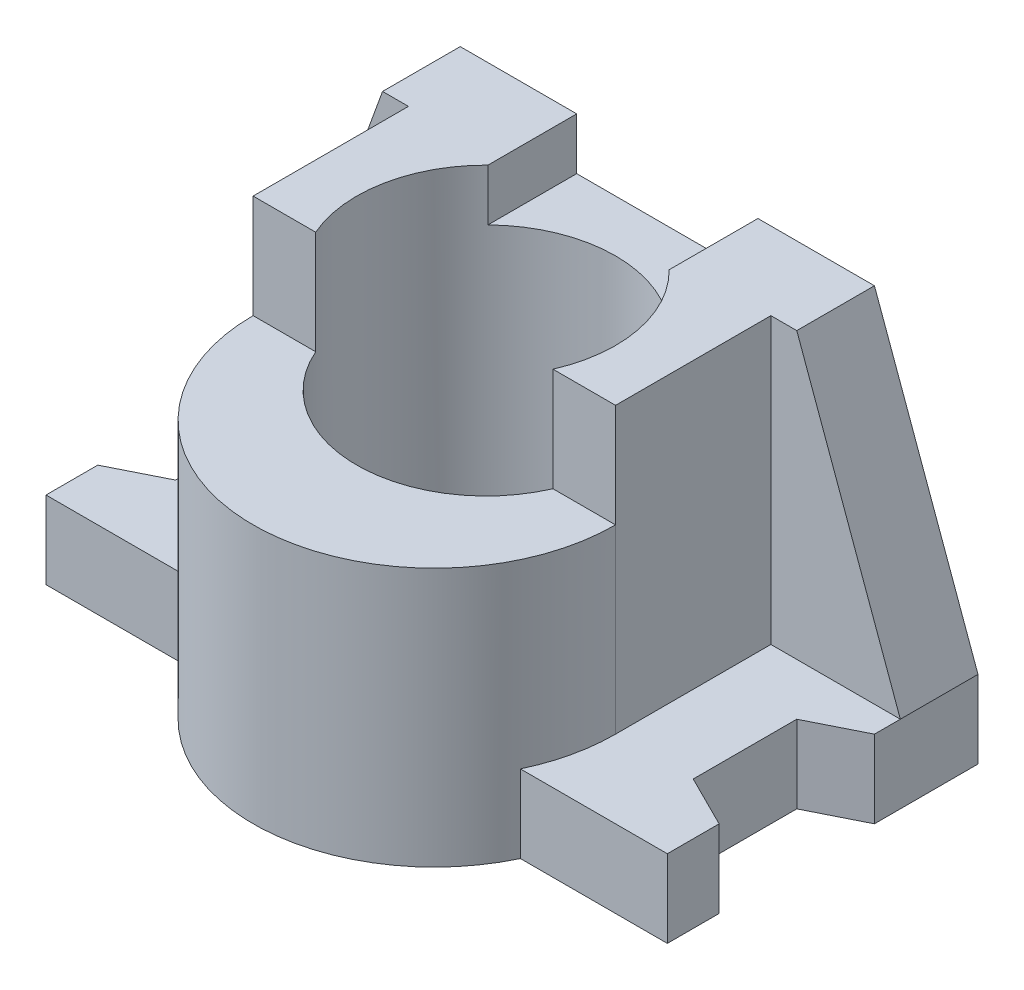
ISO-10303-21;
HEADER;
FILE_DESCRIPTION(('STEP AP214'),'2;1');
FILE_NAME('part.step','',(''),(''),'','','');
FILE_SCHEMA(('AUTOMOTIVE_DESIGN { 1 0 10303 214 1 1 1 1 }'));
ENDSEC;
DATA;
#1=APPLICATION_CONTEXT('core data for automotive mechanical design processes');
#2=APPLICATION_PROTOCOL_DEFINITION('international standard','automotive_design',2000,#1);
#3=PRODUCT_CONTEXT('',#1,'mechanical');
#4=PRODUCT('Part','Part','',(#3));
#5=PRODUCT_RELATED_PRODUCT_CATEGORY('part','',(#4));
#6=PRODUCT_DEFINITION_FORMATION('','',#4);
#7=PRODUCT_DEFINITION_CONTEXT('part definition',#1,'design');
#8=PRODUCT_DEFINITION('design','',#6,#7);
#9=PRODUCT_DEFINITION_SHAPE('','',#8);
#10=(LENGTH_UNIT() NAMED_UNIT(*) SI_UNIT(.MILLI.,.METRE.));
#11=(NAMED_UNIT(*) PLANE_ANGLE_UNIT() SI_UNIT($,.RADIAN.));
#12=(NAMED_UNIT(*) SI_UNIT($,.STERADIAN.) SOLID_ANGLE_UNIT());
#13=UNCERTAINTY_MEASURE_WITH_UNIT(LENGTH_MEASURE(1.E-05),#10,'distance_accuracy_value','');
#14=(GEOMETRIC_REPRESENTATION_CONTEXT(3) GLOBAL_UNCERTAINTY_ASSIGNED_CONTEXT((#13)) GLOBAL_UNIT_ASSIGNED_CONTEXT((#10,
#11,#12)) REPRESENTATION_CONTEXT('',''));
#15=CARTESIAN_POINT('',(0.,0.,0.));
#16=DIRECTION('',(0.,0.,1.));
#17=DIRECTION('',(1.,0.,0.));
#18=AXIS2_PLACEMENT_3D('',#15,#16,#17);
#19=CARTESIAN_POINT('',(0.,15.,0.));
#20=DIRECTION('',(0.,1.,0.));
#21=DIRECTION('',(0.,0.,1.));
#22=AXIS2_PLACEMENT_3D('',#19,#20,#21);
#23=PLANE('',#22);
#24=DIRECTION('',(0.,0.,1.));
#25=VECTOR('',#24,1.);
#26=CARTESIAN_POINT('',(60.,15.,0.));
#27=LINE('',#26,#25);
#28=CARTESIAN_POINT('',(60.,15.,-7.27417801355407));
#29=VERTEX_POINT('',#28);
#30=CARTESIAN_POINT('',(60.,15.,-2.27417801355408));
#31=VERTEX_POINT('',#30);
#32=EDGE_CURVE('E339',#29,#31,#27,.T.);
#33=ORIENTED_EDGE('',*,*,#32,.F.);
#34=DIRECTION('',(-1.,0.,0.));
#35=VECTOR('',#34,1.);
#36=CARTESIAN_POINT('',(0.,15.,-7.27417801355405));
#37=LINE('',#36,#35);
#38=CARTESIAN_POINT('',(35.,15.,-7.27417801355407));
#39=VERTEX_POINT('',#38);
#40=EDGE_CURVE('E54',#29,#39,#37,.T.);
#41=ORIENTED_EDGE('',*,*,#40,.T.);
#42=DIRECTION('',(0.,0.,1.));
#43=VECTOR('',#42,1.);
#44=CARTESIAN_POINT('',(35.,15.,0.));
#45=LINE('',#44,#43);
#46=CARTESIAN_POINT('',(35.,15.,22.7258219864459));
#47=VERTEX_POINT('',#46);
#48=EDGE_CURVE('E344',#39,#47,#45,.T.);
#49=ORIENTED_EDGE('',*,*,#48,.T.);
#50=CARTESIAN_POINT('',(0.,15.,22.7258219864459));
#51=DIRECTION('',(0.,1.,0.));
#52=DIRECTION('',(0.,0.,1.));
#53=AXIS2_PLACEMENT_3D('',#50,#51,#52);
#54=CIRCLE('',#53,35.);
#55=CARTESIAN_POINT('',(31.6227766016838,15.,37.7258219864459));
#56=VERTEX_POINT('',#55);
#57=EDGE_CURVE('E322',#56,#47,#54,.T.);
#58=ORIENTED_EDGE('',*,*,#57,.F.);
#59=DIRECTION('',(-1.,0.,0.));
#60=VECTOR('',#59,1.);
#61=CARTESIAN_POINT('',(0.,15.,37.7258219864459));
#62=LINE('',#61,#60);
#63=CARTESIAN_POINT('',(60.,15.,37.7258219864459));
#64=VERTEX_POINT('',#63);
#65=EDGE_CURVE('E325',#64,#56,#62,.T.);
#66=ORIENTED_EDGE('',*,*,#65,.F.);
#67=DIRECTION('',(0.,0.,-1.));
#68=VECTOR('',#67,1.);
#69=CARTESIAN_POINT('',(60.,15.,0.));
#70=LINE('',#69,#68);
#71=CARTESIAN_POINT('',(60.,15.,27.7258219864459));
#72=VERTEX_POINT('',#71);
#73=EDGE_CURVE('E329',#64,#72,#70,.T.);
#74=ORIENTED_EDGE('',*,*,#73,.T.);
#75=DIRECTION('',(0.894427190999916,0.,0.447213595499958));
#76=VECTOR('',#75,1.);
#77=CARTESIAN_POINT('',(0.90967120542162,15.,-1.81934241084324));
#78=LINE('',#77,#76);
#79=CARTESIAN_POINT('',(50.,15.,22.7258219864459));
#80=VERTEX_POINT('',#79);
#81=EDGE_CURVE('E331',#80,#72,#78,.T.);
#82=ORIENTED_EDGE('',*,*,#81,.F.);
#83=DIRECTION('',(0.,0.,-1.));
#84=VECTOR('',#83,1.);
#85=CARTESIAN_POINT('',(50.,15.,0.));
#86=LINE('',#85,#84);
#87=CARTESIAN_POINT('',(50.,15.,2.72582198644592));
#88=VERTEX_POINT('',#87);
#89=EDGE_CURVE('E334',#80,#88,#86,.T.);
#90=ORIENTED_EDGE('',*,*,#89,.T.);
#91=DIRECTION('',(-0.894427190999916,0.,0.447213595499958));
#92=VECTOR('',#91,1.);
#93=CARTESIAN_POINT('',(11.0903287945784,15.,22.1806575891567));
#94=LINE('',#93,#92);
#95=EDGE_CURVE('E336',#31,#88,#94,.T.);
#96=ORIENTED_EDGE('',*,*,#95,.F.);
#97=EDGE_LOOP('',(#33,#41,#49,#58,#66,#74,#82,#90,#96));
#98=FACE_BOUND('',#97,.T.);
#99=ADVANCED_FACE('F39',(#98),#23,.T.);
#100=CARTESIAN_POINT('',(0.,15.,-22.2741780135541));
#101=DIRECTION('',(0.,0.,1.));
#102=DIRECTION('',(1.,0.,0.));
#103=AXIS2_PLACEMENT_3D('',#100,#101,#102);
#104=PLANE('',#103);
#105=DIRECTION('',(0.341743063086704,-0.939793423488437,0.));
#106=VECTOR('',#105,1.);
#107=CARTESIAN_POINT('',(40.,70.,-22.2741780135541));
#108=LINE('',#107,#106);
#109=CARTESIAN_POINT('',(40.,70.,-22.2741780135541));
#110=VERTEX_POINT('',#109);
#111=CARTESIAN_POINT('',(60.,15.,-22.2741780135541));
#112=VERTEX_POINT('',#111);
#113=EDGE_CURVE('E244',#110,#112,#108,.T.);
#114=ORIENTED_EDGE('',*,*,#113,.T.);
#115=DIRECTION('',(0.,-1.,0.));
#116=VECTOR('',#115,1.);
#117=CARTESIAN_POINT('',(60.,15.,-22.2741780135541));
#118=LINE('',#117,#116);
#119=CARTESIAN_POINT('',(60.,0.,-22.2741780135541));
#120=VERTEX_POINT('',#119);
#121=EDGE_CURVE('E347',#112,#120,#118,.T.);
#122=ORIENTED_EDGE('',*,*,#121,.T.);
#123=DIRECTION('',(-1.,0.,0.));
#124=VECTOR('',#123,1.);
#125=CARTESIAN_POINT('',(0.,0.,-22.2741780135541));
#126=LINE('',#125,#124);
#127=CARTESIAN_POINT('',(-60.,0.,-22.2741780135541));
#128=VERTEX_POINT('',#127);
#129=EDGE_CURVE('E400',#120,#128,#126,.T.);
#130=ORIENTED_EDGE('',*,*,#129,.T.);
#131=DIRECTION('',(0.,-1.,0.));
#132=VECTOR('',#131,1.);
#133=CARTESIAN_POINT('',(-60.,15.,-22.2741780135541));
#134=LINE('',#133,#132);
#135=CARTESIAN_POINT('',(-60.,15.,-22.2741780135541));
#136=VERTEX_POINT('',#135);
#137=EDGE_CURVE('E11',#136,#128,#134,.T.);
#138=ORIENTED_EDGE('',*,*,#137,.F.);
#139=DIRECTION('',(0.341743063086704,0.939793423488437,0.));
#140=VECTOR('',#139,1.);
#141=CARTESIAN_POINT('',(-40.,70.,-22.2741780135541));
#142=LINE('',#141,#140);
#143=CARTESIAN_POINT('',(-40.,70.,-22.2741780135541));
#144=VERTEX_POINT('',#143);
#145=EDGE_CURVE('E248',#136,#144,#142,.T.);
#146=ORIENTED_EDGE('',*,*,#145,.T.);
#147=DIRECTION('',(1.,0.,0.));
#148=VECTOR('',#147,1.);
#149=CARTESIAN_POINT('',(0.,70.,-22.2741780135541));
#150=LINE('',#149,#148);
#151=CARTESIAN_POINT('',(-17.5,70.,-22.2741780135541));
#152=VERTEX_POINT('',#151);
#153=EDGE_CURVE('E293',#144,#152,#150,.T.);
#154=ORIENTED_EDGE('',*,*,#153,.T.);
#155=DIRECTION('',(0.,-1.,0.));
#156=VECTOR('',#155,1.);
#157=CARTESIAN_POINT('',(-17.5,70.,-22.2741780135541));
#158=LINE('',#157,#156);
#159=CARTESIAN_POINT('',(-17.5,60.,-22.2741780135541));
#160=VERTEX_POINT('',#159);
#161=EDGE_CURVE('E315',#152,#160,#158,.T.);
#162=ORIENTED_EDGE('',*,*,#161,.T.);
#163=DIRECTION('',(1.,0.,0.));
#164=VECTOR('',#163,1.);
#165=CARTESIAN_POINT('',(0.,60.,-22.2741780135541));
#166=LINE('',#165,#164);
#167=CARTESIAN_POINT('',(17.5,60.,-22.2741780135541));
#168=VERTEX_POINT('',#167);
#169=EDGE_CURVE('E261',#160,#168,#166,.T.);
#170=ORIENTED_EDGE('',*,*,#169,.T.);
#171=DIRECTION('',(0.,-1.,0.));
#172=VECTOR('',#171,1.);
#173=CARTESIAN_POINT('',(17.5,70.,-22.2741780135541));
#174=LINE('',#173,#172);
#175=CARTESIAN_POINT('',(17.5,70.,-22.2741780135541));
#176=VERTEX_POINT('',#175);
#177=EDGE_CURVE('E62',#176,#168,#174,.T.);
#178=ORIENTED_EDGE('',*,*,#177,.F.);
#179=DIRECTION('',(1.,0.,0.));
#180=VECTOR('',#179,1.);
#181=CARTESIAN_POINT('',(0.,70.,-22.2741780135541));
#182=LINE('',#181,#180);
#183=EDGE_CURVE('E245',#176,#110,#182,.T.);
#184=ORIENTED_EDGE('',*,*,#183,.T.);
#185=EDGE_LOOP('',(#114,#122,#130,#138,#146,#154,#162,#170,#178,#184));
#186=FACE_BOUND('',#185,.T.);
#187=ADVANCED_FACE('F41',(#186),#104,.F.);
#188=CARTESIAN_POINT('',(-60.,15.,0.));
#189=DIRECTION('',(1.,0.,0.));
#190=DIRECTION('',(0.,0.,-1.));
#191=AXIS2_PLACEMENT_3D('',#188,#189,#190);
#192=PLANE('',#191);
#193=DIRECTION('',(0.,0.,1.));
#194=VECTOR('',#193,1.);
#195=CARTESIAN_POINT('',(-60.,0.,0.));
#196=LINE('',#195,#194);
#197=CARTESIAN_POINT('',(-60.,0.,-2.27417801355408));
#198=VERTEX_POINT('',#197);
#199=EDGE_CURVE('E428',#128,#198,#196,.T.);
#200=ORIENTED_EDGE('',*,*,#199,.T.);
#201=DIRECTION('',(0.,-1.,0.));
#202=VECTOR('',#201,1.);
#203=CARTESIAN_POINT('',(-60.,15.,-2.27417801355408));
#204=LINE('',#203,#202);
#205=CARTESIAN_POINT('',(-60.,15.,-2.27417801355408));
#206=VERTEX_POINT('',#205);
#207=EDGE_CURVE('E47',#206,#198,#204,.T.);
#208=ORIENTED_EDGE('',*,*,#207,.F.);
#209=DIRECTION('',(0.,0.,1.));
#210=VECTOR('',#209,1.);
#211=CARTESIAN_POINT('',(-60.,15.,0.));
#212=LINE('',#211,#210);
#213=CARTESIAN_POINT('',(-60.,15.,-7.27417801355408));
#214=VERTEX_POINT('',#213);
#215=EDGE_CURVE('E409',#214,#206,#212,.T.);
#216=ORIENTED_EDGE('',*,*,#215,.F.);
#217=EDGE_CURVE('E410',#136,#214,#212,.T.);
#218=ORIENTED_EDGE('',*,*,#217,.F.);
#219=ORIENTED_EDGE('',*,*,#137,.T.);
#220=EDGE_LOOP('',(#200,#208,#216,#218,#219));
#221=FACE_BOUND('',#220,.T.);
#222=ADVANCED_FACE('F476',(#221),#192,.F.);
#223=CARTESIAN_POINT('',(-11.0903287945784,15.,22.1806575891567));
#224=DIRECTION('',(0.447213595499958,0.,-0.894427190999916));
#225=DIRECTION('',(-0.894427190999916,0.,-0.447213595499958));
#226=AXIS2_PLACEMENT_3D('',#223,#224,#225);
#227=PLANE('',#226);
#228=DIRECTION('',(0.894427190999916,0.,0.447213595499958));
#229=VECTOR('',#228,1.);
#230=CARTESIAN_POINT('',(-11.0903287945784,0.,22.1806575891567));
#231=LINE('',#230,#229);
#232=CARTESIAN_POINT('',(-50.,0.,2.72582198644592));
#233=VERTEX_POINT('',#232);
#234=EDGE_CURVE('E430',#198,#233,#231,.T.);
#235=ORIENTED_EDGE('',*,*,#234,.T.);
#236=DIRECTION('',(0.,-1.,0.));
#237=VECTOR('',#236,1.);
#238=CARTESIAN_POINT('',(-50.,15.,2.72582198644592));
#239=LINE('',#238,#237);
#240=CARTESIAN_POINT('',(-50.,15.,2.72582198644592));
#241=VERTEX_POINT('',#240);
#242=EDGE_CURVE('E452',#241,#233,#239,.T.);
#243=ORIENTED_EDGE('',*,*,#242,.F.);
#244=DIRECTION('',(0.894427190999916,0.,0.447213595499958));
#245=VECTOR('',#244,1.);
#246=CARTESIAN_POINT('',(-11.0903287945784,15.,22.1806575891567));
#247=LINE('',#246,#245);
#248=EDGE_CURVE('E413',#206,#241,#247,.T.);
#249=ORIENTED_EDGE('',*,*,#248,.F.);
#250=ORIENTED_EDGE('',*,*,#207,.T.);
#251=EDGE_LOOP('',(#235,#243,#249,#250));
#252=FACE_BOUND('',#251,.T.);
#253=ADVANCED_FACE('F458',(#252),#227,.F.);
#254=CARTESIAN_POINT('',(-50.,15.,0.));
#255=DIRECTION('',(-1.,0.,0.));
#256=DIRECTION('',(0.,0.,1.));
#257=AXIS2_PLACEMENT_3D('',#254,#255,#256);
#258=PLANE('',#257);
#259=DIRECTION('',(0.,0.,-1.));
#260=VECTOR('',#259,1.);
#261=CARTESIAN_POINT('',(-50.,0.,0.));
#262=LINE('',#261,#260);
#263=CARTESIAN_POINT('',(-50.,0.,22.7258219864459));
#264=VERTEX_POINT('',#263);
#265=EDGE_CURVE('E433',#264,#233,#262,.T.);
#266=ORIENTED_EDGE('',*,*,#265,.F.);
#267=DIRECTION('',(0.,-1.,0.));
#268=VECTOR('',#267,1.);
#269=CARTESIAN_POINT('',(-50.,15.,22.7258219864459));
#270=LINE('',#269,#268);
#271=CARTESIAN_POINT('',(-50.,15.,22.7258219864459));
#272=VERTEX_POINT('',#271);
#273=EDGE_CURVE('E450',#272,#264,#270,.T.);
#274=ORIENTED_EDGE('',*,*,#273,.F.);
#275=DIRECTION('',(0.,0.,-1.));
#276=VECTOR('',#275,1.);
#277=CARTESIAN_POINT('',(-50.,15.,0.));
#278=LINE('',#277,#276);
#279=EDGE_CURVE('E415',#272,#241,#278,.T.);
#280=ORIENTED_EDGE('',*,*,#279,.T.);
#281=ORIENTED_EDGE('',*,*,#242,.T.);
#282=EDGE_LOOP('',(#266,#274,#280,#281));
#283=FACE_BOUND('',#282,.T.);
#284=ADVANCED_FACE('F468',(#283),#258,.T.);
#285=CARTESIAN_POINT('',(-0.909671205421628,15.,-1.81934241084326));
#286=DIRECTION('',(0.447213595499958,0.,0.894427190999916));
#287=DIRECTION('',(0.894427190999916,0.,-0.447213595499958));
#288=AXIS2_PLACEMENT_3D('',#285,#286,#287);
#289=PLANE('',#288);
#290=DIRECTION('',(-0.894427190999916,0.,0.447213595499958));
#291=VECTOR('',#290,1.);
#292=CARTESIAN_POINT('',(-0.909671205421628,0.,-1.81934241084326));
#293=LINE('',#292,#291);
#294=CARTESIAN_POINT('',(-60.,0.,27.7258219864459));
#295=VERTEX_POINT('',#294);
#296=EDGE_CURVE('E436',#264,#295,#293,.T.);
#297=ORIENTED_EDGE('',*,*,#296,.T.);
#298=DIRECTION('',(0.,-1.,0.));
#299=VECTOR('',#298,1.);
#300=CARTESIAN_POINT('',(-60.,15.,27.7258219864459));
#301=LINE('',#300,#299);
#302=CARTESIAN_POINT('',(-60.,15.,27.7258219864459));
#303=VERTEX_POINT('',#302);
#304=EDGE_CURVE('E448',#303,#295,#301,.T.);
#305=ORIENTED_EDGE('',*,*,#304,.F.);
#306=DIRECTION('',(-0.894427190999916,0.,0.447213595499958));
#307=VECTOR('',#306,1.);
#308=CARTESIAN_POINT('',(-0.909671205421628,15.,-1.81934241084326));
#309=LINE('',#308,#307);
#310=EDGE_CURVE('E418',#272,#303,#309,.T.);
#311=ORIENTED_EDGE('',*,*,#310,.F.);
#312=ORIENTED_EDGE('',*,*,#273,.T.);
#313=EDGE_LOOP('',(#297,#305,#311,#312));
#314=FACE_BOUND('',#313,.T.);
#315=ADVANCED_FACE('F530',(#314),#289,.F.);
#316=CARTESIAN_POINT('',(-60.,15.,0.));
#317=DIRECTION('',(-1.,0.,0.));
#318=DIRECTION('',(0.,0.,1.));
#319=AXIS2_PLACEMENT_3D('',#316,#317,#318);
#320=PLANE('',#319);
#321=DIRECTION('',(0.,0.,-1.));
#322=VECTOR('',#321,1.);
#323=CARTESIAN_POINT('',(-60.,0.,0.));
#324=LINE('',#323,#322);
#325=CARTESIAN_POINT('',(-60.,0.,37.7258219864459));
#326=VERTEX_POINT('',#325);
#327=EDGE_CURVE('E439',#326,#295,#324,.T.);
#328=ORIENTED_EDGE('',*,*,#327,.F.);
#329=DIRECTION('',(0.,-1.,0.));
#330=VECTOR('',#329,1.);
#331=CARTESIAN_POINT('',(-60.,15.,37.7258219864459));
#332=LINE('',#331,#330);
#333=CARTESIAN_POINT('',(-60.,15.,37.7258219864459));
#334=VERTEX_POINT('',#333);
#335=EDGE_CURVE('E446',#334,#326,#332,.T.);
#336=ORIENTED_EDGE('',*,*,#335,.F.);
#337=DIRECTION('',(0.,0.,-1.));
#338=VECTOR('',#337,1.);
#339=CARTESIAN_POINT('',(-60.,15.,0.));
#340=LINE('',#339,#338);
#341=EDGE_CURVE('E420',#334,#303,#340,.T.);
#342=ORIENTED_EDGE('',*,*,#341,.T.);
#343=ORIENTED_EDGE('',*,*,#304,.T.);
#344=EDGE_LOOP('',(#328,#336,#342,#343));
#345=FACE_BOUND('',#344,.T.);
#346=ADVANCED_FACE('F527',(#345),#320,.T.);
#347=CARTESIAN_POINT('',(0.,15.,37.7258219864459));
#348=DIRECTION('',(0.,0.,-1.));
#349=DIRECTION('',(-1.,0.,0.));
#350=AXIS2_PLACEMENT_3D('',#347,#348,#349);
#351=PLANE('',#350);
#352=DIRECTION('',(1.,0.,0.));
#353=VECTOR('',#352,1.);
#354=CARTESIAN_POINT('',(0.,0.,37.7258219864459));
#355=LINE('',#354,#353);
#356=CARTESIAN_POINT('',(-31.6227766016838,0.,37.7258219864459));
#357=VERTEX_POINT('',#356);
#358=EDGE_CURVE('E404',#326,#357,#355,.T.);
#359=ORIENTED_EDGE('',*,*,#358,.T.);
#360=DIRECTION('',(0.,-1.,0.));
#361=VECTOR('',#360,1.);
#362=CARTESIAN_POINT('',(-31.6227766016838,15.,37.7258219864459));
#363=LINE('',#362,#361);
#364=CARTESIAN_POINT('',(-31.6227766016838,15.,37.7258219864459));
#365=VERTEX_POINT('',#364);
#366=EDGE_CURVE('E426',#365,#357,#363,.T.);
#367=ORIENTED_EDGE('',*,*,#366,.F.);
#368=DIRECTION('',(1.,0.,0.));
#369=VECTOR('',#368,1.);
#370=CARTESIAN_POINT('',(0.,15.,37.7258219864459));
#371=LINE('',#370,#369);
#372=EDGE_CURVE('E423',#334,#365,#371,.T.);
#373=ORIENTED_EDGE('',*,*,#372,.F.);
#374=ORIENTED_EDGE('',*,*,#335,.T.);
#375=EDGE_LOOP('',(#359,#367,#373,#374));
#376=FACE_BOUND('',#375,.T.);
#377=ADVANCED_FACE('F537',(#376),#351,.F.);
#378=CARTESIAN_POINT('',(0.,15.,0.));
#379=DIRECTION('',(0.,1.,0.));
#380=DIRECTION('',(0.,0.,1.));
#381=AXIS2_PLACEMENT_3D('',#378,#379,#380);
#382=PLANE('',#381);
#383=DIRECTION('',(1.,0.,0.));
#384=VECTOR('',#383,1.);
#385=CARTESIAN_POINT('',(0.,15.,-7.27417801355405));
#386=LINE('',#385,#384);
#387=CARTESIAN_POINT('',(-35.,15.,-7.27417801355408));
#388=VERTEX_POINT('',#387);
#389=EDGE_CURVE('E406',#214,#388,#386,.T.);
#390=ORIENTED_EDGE('',*,*,#389,.F.);
#391=ORIENTED_EDGE('',*,*,#215,.T.);
#392=ORIENTED_EDGE('',*,*,#248,.T.);
#393=ORIENTED_EDGE('',*,*,#279,.F.);
#394=ORIENTED_EDGE('',*,*,#310,.T.);
#395=ORIENTED_EDGE('',*,*,#341,.F.);
#396=ORIENTED_EDGE('',*,*,#372,.T.);
#397=CARTESIAN_POINT('',(0.,15.,22.7258219864459));
#398=DIRECTION('',(0.,1.,0.));
#399=DIRECTION('',(0.,0.,1.));
#400=AXIS2_PLACEMENT_3D('',#397,#398,#399);
#401=CIRCLE('',#400,35.);
#402=CARTESIAN_POINT('',(-35.,15.,22.7258219864459));
#403=VERTEX_POINT('',#402);
#404=EDGE_CURVE('E401',#403,#365,#401,.T.);
#405=ORIENTED_EDGE('',*,*,#404,.F.);
#406=DIRECTION('',(0.,0.,-1.));
#407=VECTOR('',#406,1.);
#408=CARTESIAN_POINT('',(-35.,15.,0.));
#409=LINE('',#408,#407);
#410=EDGE_CURVE('E403',#403,#388,#409,.T.);
#411=ORIENTED_EDGE('',*,*,#410,.T.);
#412=EDGE_LOOP('',(#390,#391,#392,#393,#394,#395,#396,#405,#411));
#413=FACE_BOUND('',#412,.T.);
#414=ADVANCED_FACE('F472',(#413),#382,.T.);
#415=CARTESIAN_POINT('',(0.,0.,0.));
#416=DIRECTION('',(0.,1.,0.));
#417=DIRECTION('',(0.,0.,1.));
#418=AXIS2_PLACEMENT_3D('',#415,#416,#417);
#419=PLANE('',#418);
#420=CARTESIAN_POINT('',(0.,0.,12.7258219864459));
#421=DIRECTION('',(0.,1.,0.));
#422=DIRECTION('',(0.,0.,1.));
#423=AXIS2_PLACEMENT_3D('',#420,#421,#422);
#424=CIRCLE('',#423,25.);
#425=CARTESIAN_POINT('',(0.,0.,37.7258219864459));
#426=VERTEX_POINT('',#425);
#427=EDGE_CURVE('E383',#426,#426,#424,.T.);
#428=ORIENTED_EDGE('',*,*,#427,.T.);
#429=EDGE_LOOP('',(#428));
#430=FACE_BOUND('',#429,.T.);
#431=ORIENTED_EDGE('',*,*,#129,.F.);
#432=DIRECTION('',(0.,0.,1.));
#433=VECTOR('',#432,1.);
#434=CARTESIAN_POINT('',(60.,0.,0.));
#435=LINE('',#434,#433);
#436=CARTESIAN_POINT('',(60.,0.,-2.27417801355408));
#437=VERTEX_POINT('',#436);
#438=EDGE_CURVE('E326',#120,#437,#435,.T.);
#439=ORIENTED_EDGE('',*,*,#438,.T.);
#440=DIRECTION('',(-0.894427190999916,0.,0.447213595499958));
#441=VECTOR('',#440,1.);
#442=CARTESIAN_POINT('',(11.0903287945784,0.,22.1806575891567));
#443=LINE('',#442,#441);
#444=CARTESIAN_POINT('',(50.,0.,2.72582198644592));
#445=VERTEX_POINT('',#444);
#446=EDGE_CURVE('E359',#437,#445,#443,.T.);
#447=ORIENTED_EDGE('',*,*,#446,.T.);
#448=DIRECTION('',(0.,0.,-1.));
#449=VECTOR('',#448,1.);
#450=CARTESIAN_POINT('',(50.,0.,0.));
#451=LINE('',#450,#449);
#452=CARTESIAN_POINT('',(50.,0.,22.7258219864459));
#453=VERTEX_POINT('',#452);
#454=EDGE_CURVE('E356',#453,#445,#451,.T.);
#455=ORIENTED_EDGE('',*,*,#454,.F.);
#456=DIRECTION('',(0.894427190999916,0.,0.447213595499958));
#457=VECTOR('',#456,1.);
#458=CARTESIAN_POINT('',(0.90967120542162,0.,-1.81934241084324));
#459=LINE('',#458,#457);
#460=CARTESIAN_POINT('',(60.,0.,27.7258219864459));
#461=VERTEX_POINT('',#460);
#462=EDGE_CURVE('E353',#453,#461,#459,.T.);
#463=ORIENTED_EDGE('',*,*,#462,.T.);
#464=DIRECTION('',(0.,0.,-1.));
#465=VECTOR('',#464,1.);
#466=CARTESIAN_POINT('',(60.,0.,0.));
#467=LINE('',#466,#465);
#468=CARTESIAN_POINT('',(60.,0.,37.7258219864459));
#469=VERTEX_POINT('',#468);
#470=EDGE_CURVE('E350',#469,#461,#467,.T.);
#471=ORIENTED_EDGE('',*,*,#470,.F.);
#472=DIRECTION('',(-1.,0.,0.));
#473=VECTOR('',#472,1.);
#474=CARTESIAN_POINT('',(0.,0.,37.7258219864459));
#475=LINE('',#474,#473);
#476=CARTESIAN_POINT('',(31.6227766016838,0.,37.7258219864459));
#477=VERTEX_POINT('',#476);
#478=EDGE_CURVE('E321',#469,#477,#475,.T.);
#479=ORIENTED_EDGE('',*,*,#478,.T.);
#480=CARTESIAN_POINT('',(0.,0.,22.7258219864459));
#481=DIRECTION('',(0.,1.,0.));
#482=DIRECTION('',(0.,0.,1.));
#483=AXIS2_PLACEMENT_3D('',#480,#481,#482);
#484=CIRCLE('',#483,35.);
#485=EDGE_CURVE('E378',#357,#477,#484,.T.);
#486=ORIENTED_EDGE('',*,*,#485,.F.);
#487=ORIENTED_EDGE('',*,*,#358,.F.);
#488=ORIENTED_EDGE('',*,*,#327,.T.);
#489=ORIENTED_EDGE('',*,*,#296,.F.);
#490=ORIENTED_EDGE('',*,*,#265,.T.);
#491=ORIENTED_EDGE('',*,*,#234,.F.);
#492=ORIENTED_EDGE('',*,*,#199,.F.);
#493=EDGE_LOOP('',(#431,#439,#447,#455,#463,#471,#479,#486,#487,#488,#489,#490,#491,#492));
#494=FACE_BOUND('',#493,.T.);
#495=ADVANCED_FACE('F464',(#430,#494),#419,.F.);
#496=CARTESIAN_POINT('',(0.,50.,22.7258219864459));
#497=DIRECTION('',(0.,-1.,0.));
#498=DIRECTION('',(0.,0.,-1.));
#499=AXIS2_PLACEMENT_3D('',#496,#497,#498);
#500=CYLINDRICAL_SURFACE('',#499,35.);
#501=ORIENTED_EDGE('',*,*,#485,.T.);
#502=DIRECTION('',(0.,-1.,0.));
#503=VECTOR('',#502,1.);
#504=CARTESIAN_POINT('',(31.6227766016838,15.,37.7258219864459));
#505=LINE('',#504,#503);
#506=EDGE_CURVE('E376',#56,#477,#505,.T.);
#507=ORIENTED_EDGE('',*,*,#506,.F.);
#508=ORIENTED_EDGE('',*,*,#57,.T.);
#509=DIRECTION('',(0.,-1.,0.));
#510=VECTOR('',#509,1.);
#511=CARTESIAN_POINT('',(35.,50.,22.7258219864459));
#512=LINE('',#511,#510);
#513=CARTESIAN_POINT('',(35.,50.,22.7258219864459));
#514=VERTEX_POINT('',#513);
#515=EDGE_CURVE('E398',#514,#47,#512,.T.);
#516=ORIENTED_EDGE('',*,*,#515,.F.);
#517=CARTESIAN_POINT('',(0.,50.,22.7258219864459));
#518=DIRECTION('',(0.,1.,0.));
#519=DIRECTION('',(0.,0.,1.));
#520=AXIS2_PLACEMENT_3D('',#517,#518,#519);
#521=CIRCLE('',#520,35.);
#522=CARTESIAN_POINT('',(-35.,50.,22.7258219864459));
#523=VERTEX_POINT('',#522);
#524=EDGE_CURVE('E379',#523,#514,#521,.T.);
#525=ORIENTED_EDGE('',*,*,#524,.F.);
#526=DIRECTION('',(0.,-1.,0.));
#527=VECTOR('',#526,1.);
#528=CARTESIAN_POINT('',(-35.,50.,22.7258219864459));
#529=LINE('',#528,#527);
#530=EDGE_CURVE('E392',#523,#403,#529,.T.);
#531=ORIENTED_EDGE('',*,*,#530,.T.);
#532=ORIENTED_EDGE('',*,*,#404,.T.);
#533=ORIENTED_EDGE('',*,*,#366,.T.);
#534=EDGE_LOOP('',(#501,#507,#508,#516,#525,#531,#532,#533));
#535=FACE_BOUND('',#534,.T.);
#536=ADVANCED_FACE('F520',(#535),#500,.T.);
#537=CARTESIAN_POINT('',(0.,50.,12.7258219864459));
#538=DIRECTION('',(0.,-1.,0.));
#539=DIRECTION('',(0.,0.,-1.));
#540=AXIS2_PLACEMENT_3D('',#537,#538,#539);
#541=CYLINDRICAL_SURFACE('',#540,25.);
#542=ORIENTED_EDGE('',*,*,#427,.F.);
#543=EDGE_LOOP('',(#542));
#544=FACE_BOUND('',#543,.T.);
#545=CARTESIAN_POINT('',(0.,60.,12.7258219864459));
#546=DIRECTION('',(0.,1.,0.));
#547=DIRECTION('',(0.,0.,1.));
#548=AXIS2_PLACEMENT_3D('',#545,#546,#547);
#549=CIRCLE('',#548,25.);
#550=CARTESIAN_POINT('',(17.5,60.,-5.1277490849112));
#551=VERTEX_POINT('',#550);
#552=CARTESIAN_POINT('',(-17.5,60.,-5.1277490849112));
#553=VERTEX_POINT('',#552);
#554=EDGE_CURVE('E255',#551,#553,#549,.T.);
#555=ORIENTED_EDGE('',*,*,#554,.T.);
#556=DIRECTION('',(0.,-1.,0.));
#557=VECTOR('',#556,1.);
#558=CARTESIAN_POINT('',(-17.5,70.,-5.1277490849112));
#559=LINE('',#558,#557);
#560=CARTESIAN_POINT('',(-17.5,70.,-5.1277490849112));
#561=VERTEX_POINT('',#560);
#562=EDGE_CURVE('E318',#561,#553,#559,.T.);
#563=ORIENTED_EDGE('',*,*,#562,.F.);
#564=CARTESIAN_POINT('',(0.,70.,12.7258219864459));
#565=DIRECTION('',(0.,1.,0.));
#566=DIRECTION('',(0.,0.,1.));
#567=AXIS2_PLACEMENT_3D('',#564,#565,#566);
#568=CIRCLE('',#567,25.);
#569=CARTESIAN_POINT('',(-22.9128784747792,70.,22.7258219864459));
#570=VERTEX_POINT('',#569);
#571=EDGE_CURVE('E287',#561,#570,#568,.T.);
#572=ORIENTED_EDGE('',*,*,#571,.T.);
#573=DIRECTION('',(0.,-1.,0.));
#574=VECTOR('',#573,1.);
#575=CARTESIAN_POINT('',(-22.9128784747792,70.,22.7258219864459));
#576=LINE('',#575,#574);
#577=CARTESIAN_POINT('',(-22.9128784747792,50.,22.7258219864459));
#578=VERTEX_POINT('',#577);
#579=EDGE_CURVE('E306',#570,#578,#576,.T.);
#580=ORIENTED_EDGE('',*,*,#579,.T.);
#581=CARTESIAN_POINT('',(0.,50.,12.7258219864459));
#582=DIRECTION('',(0.,1.,0.));
#583=DIRECTION('',(0.,0.,1.));
#584=AXIS2_PLACEMENT_3D('',#581,#582,#583);
#585=CIRCLE('',#584,25.);
#586=CARTESIAN_POINT('',(22.9128784747792,50.,22.7258219864459));
#587=VERTEX_POINT('',#586);
#588=EDGE_CURVE('E386',#578,#587,#585,.T.);
#589=ORIENTED_EDGE('',*,*,#588,.T.);
#590=DIRECTION('',(0.,-1.,0.));
#591=VECTOR('',#590,1.);
#592=CARTESIAN_POINT('',(22.9128784747792,70.,22.7258219864459));
#593=LINE('',#592,#591);
#594=CARTESIAN_POINT('',(22.9128784747792,70.,22.7258219864459));
#595=VERTEX_POINT('',#594);
#596=EDGE_CURVE('E285',#595,#587,#593,.T.);
#597=ORIENTED_EDGE('',*,*,#596,.F.);
#598=CARTESIAN_POINT('',(0.,70.,12.7258219864459));
#599=DIRECTION('',(0.,1.,0.));
#600=DIRECTION('',(0.,0.,1.));
#601=AXIS2_PLACEMENT_3D('',#598,#599,#600);
#602=CIRCLE('',#601,25.);
#603=CARTESIAN_POINT('',(17.5,70.,-5.1277490849112));
#604=VERTEX_POINT('',#603);
#605=EDGE_CURVE('E266',#595,#604,#602,.T.);
#606=ORIENTED_EDGE('',*,*,#605,.T.);
#607=DIRECTION('',(0.,-1.,0.));
#608=VECTOR('',#607,1.);
#609=CARTESIAN_POINT('',(17.5,70.,-5.1277490849112));
#610=LINE('',#609,#608);
#611=EDGE_CURVE('E276',#604,#551,#610,.T.);
#612=ORIENTED_EDGE('',*,*,#611,.T.);
#613=EDGE_LOOP('',(#555,#563,#572,#580,#589,#597,#606,#612));
#614=FACE_BOUND('',#613,.T.);
#615=ADVANCED_FACE('F565',(#544,#614),#541,.F.);
#616=CARTESIAN_POINT('',(0.,50.,0.));
#617=DIRECTION('',(0.,1.,0.));
#618=DIRECTION('',(0.,0.,1.));
#619=AXIS2_PLACEMENT_3D('',#616,#617,#618);
#620=PLANE('',#619);
#621=ORIENTED_EDGE('',*,*,#524,.T.);
#622=DIRECTION('',(-1.,0.,0.));
#623=VECTOR('',#622,1.);
#624=CARTESIAN_POINT('',(0.,50.,22.7258219864459));
#625=LINE('',#624,#623);
#626=EDGE_CURVE('E382',#514,#587,#625,.T.);
#627=ORIENTED_EDGE('',*,*,#626,.T.);
#628=ORIENTED_EDGE('',*,*,#588,.F.);
#629=DIRECTION('',(1.,0.,0.));
#630=VECTOR('',#629,1.);
#631=CARTESIAN_POINT('',(0.,50.,22.7258219864459));
#632=LINE('',#631,#630);
#633=EDGE_CURVE('E389',#523,#578,#632,.T.);
#634=ORIENTED_EDGE('',*,*,#633,.F.);
#635=EDGE_LOOP('',(#621,#627,#628,#634));
#636=FACE_BOUND('',#635,.T.);
#637=ADVANCED_FACE('F562',(#636),#620,.T.);
#638=CARTESIAN_POINT('',(0.,15.,37.7258219864459));
#639=DIRECTION('',(0.,0.,1.));
#640=DIRECTION('',(1.,0.,0.));
#641=AXIS2_PLACEMENT_3D('',#638,#639,#640);
#642=PLANE('',#641);
#643=ORIENTED_EDGE('',*,*,#478,.F.);
#644=DIRECTION('',(0.,-1.,0.));
#645=VECTOR('',#644,1.);
#646=CARTESIAN_POINT('',(60.,15.,37.7258219864459));
#647=LINE('',#646,#645);
#648=EDGE_CURVE('E374',#64,#469,#647,.T.);
#649=ORIENTED_EDGE('',*,*,#648,.F.);
#650=ORIENTED_EDGE('',*,*,#65,.T.);
#651=ORIENTED_EDGE('',*,*,#506,.T.);
#652=EDGE_LOOP('',(#643,#649,#650,#651));
#653=FACE_BOUND('',#652,.T.);
#654=ADVANCED_FACE('F516',(#653),#642,.T.);
#655=CARTESIAN_POINT('',(60.,15.,0.));
#656=DIRECTION('',(-1.,0.,0.));
#657=DIRECTION('',(0.,0.,1.));
#658=AXIS2_PLACEMENT_3D('',#655,#656,#657);
#659=PLANE('',#658);
#660=ORIENTED_EDGE('',*,*,#470,.T.);
#661=DIRECTION('',(0.,-1.,0.));
#662=VECTOR('',#661,1.);
#663=CARTESIAN_POINT('',(60.,15.,27.7258219864459));
#664=LINE('',#663,#662);
#665=EDGE_CURVE('E372',#72,#461,#664,.T.);
#666=ORIENTED_EDGE('',*,*,#665,.F.);
#667=ORIENTED_EDGE('',*,*,#73,.F.);
#668=ORIENTED_EDGE('',*,*,#648,.T.);
#669=EDGE_LOOP('',(#660,#666,#667,#668));
#670=FACE_BOUND('',#669,.T.);
#671=ADVANCED_FACE('F513',(#670),#659,.F.);
#672=CARTESIAN_POINT('',(0.90967120542162,15.,-1.81934241084324));
#673=DIRECTION('',(0.447213595499958,0.,-0.894427190999916));
#674=DIRECTION('',(-0.894427190999916,0.,-0.447213595499958));
#675=AXIS2_PLACEMENT_3D('',#672,#673,#674);
#676=PLANE('',#675);
#677=ORIENTED_EDGE('',*,*,#462,.F.);
#678=DIRECTION('',(0.,-1.,0.));
#679=VECTOR('',#678,1.);
#680=CARTESIAN_POINT('',(50.,15.,22.7258219864459));
#681=LINE('',#680,#679);
#682=EDGE_CURVE('E370',#80,#453,#681,.T.);
#683=ORIENTED_EDGE('',*,*,#682,.F.);
#684=ORIENTED_EDGE('',*,*,#81,.T.);
#685=ORIENTED_EDGE('',*,*,#665,.T.);
#686=EDGE_LOOP('',(#677,#683,#684,#685));
#687=FACE_BOUND('',#686,.T.);
#688=ADVANCED_FACE('F508',(#687),#676,.T.);
#689=CARTESIAN_POINT('',(50.,15.,0.));
#690=DIRECTION('',(-1.,0.,0.));
#691=DIRECTION('',(0.,0.,1.));
#692=AXIS2_PLACEMENT_3D('',#689,#690,#691);
#693=PLANE('',#692);
#694=ORIENTED_EDGE('',*,*,#454,.T.);
#695=DIRECTION('',(0.,-1.,0.));
#696=VECTOR('',#695,1.);
#697=CARTESIAN_POINT('',(50.,15.,2.72582198644592));
#698=LINE('',#697,#696);
#699=EDGE_CURVE('E368',#88,#445,#698,.T.);
#700=ORIENTED_EDGE('',*,*,#699,.F.);
#701=ORIENTED_EDGE('',*,*,#89,.F.);
#702=ORIENTED_EDGE('',*,*,#682,.T.);
#703=EDGE_LOOP('',(#694,#700,#701,#702));
#704=FACE_BOUND('',#703,.T.);
#705=ADVANCED_FACE('F504',(#704),#693,.F.);
#706=CARTESIAN_POINT('',(11.0903287945784,15.,22.1806575891567));
#707=DIRECTION('',(0.447213595499958,0.,0.894427190999916));
#708=DIRECTION('',(0.894427190999916,0.,-0.447213595499958));
#709=AXIS2_PLACEMENT_3D('',#706,#707,#708);
#710=PLANE('',#709);
#711=ORIENTED_EDGE('',*,*,#446,.F.);
#712=DIRECTION('',(0.,-1.,0.));
#713=VECTOR('',#712,1.);
#714=CARTESIAN_POINT('',(60.,15.,-2.27417801355408));
#715=LINE('',#714,#713);
#716=EDGE_CURVE('E366',#31,#437,#715,.T.);
#717=ORIENTED_EDGE('',*,*,#716,.F.);
#718=ORIENTED_EDGE('',*,*,#95,.T.);
#719=ORIENTED_EDGE('',*,*,#699,.T.);
#720=EDGE_LOOP('',(#711,#717,#718,#719));
#721=FACE_BOUND('',#720,.T.);
#722=ADVANCED_FACE('F500',(#721),#710,.T.);
#723=CARTESIAN_POINT('',(60.,15.,0.));
#724=DIRECTION('',(1.,0.,0.));
#725=DIRECTION('',(0.,0.,-1.));
#726=AXIS2_PLACEMENT_3D('',#723,#724,#725);
#727=PLANE('',#726);
#728=ORIENTED_EDGE('',*,*,#438,.F.);
#729=ORIENTED_EDGE('',*,*,#121,.F.);
#730=EDGE_CURVE('E340',#112,#29,#27,.T.);
#731=ORIENTED_EDGE('',*,*,#730,.T.);
#732=ORIENTED_EDGE('',*,*,#32,.T.);
#733=ORIENTED_EDGE('',*,*,#716,.T.);
#734=EDGE_LOOP('',(#728,#729,#731,#732,#733));
#735=FACE_BOUND('',#734,.T.);
#736=ADVANCED_FACE('F496',(#735),#727,.T.);
#737=CARTESIAN_POINT('',(-17.5,70.,0.));
#738=DIRECTION('',(1.,0.,0.));
#739=DIRECTION('',(0.,0.,-1.));
#740=AXIS2_PLACEMENT_3D('',#737,#738,#739);
#741=PLANE('',#740);
#742=DIRECTION('',(0.,0.,1.));
#743=VECTOR('',#742,1.);
#744=CARTESIAN_POINT('',(-17.5,60.,0.));
#745=LINE('',#744,#743);
#746=EDGE_CURVE('E264',#160,#553,#745,.T.);
#747=ORIENTED_EDGE('',*,*,#746,.F.);
#748=ORIENTED_EDGE('',*,*,#161,.F.);
#749=DIRECTION('',(0.,0.,1.));
#750=VECTOR('',#749,1.);
#751=CARTESIAN_POINT('',(-17.5,70.,0.));
#752=LINE('',#751,#750);
#753=EDGE_CURVE('E290',#152,#561,#752,.T.);
#754=ORIENTED_EDGE('',*,*,#753,.T.);
#755=ORIENTED_EDGE('',*,*,#562,.T.);
#756=EDGE_LOOP('',(#747,#748,#754,#755));
#757=FACE_BOUND('',#756,.T.);
#758=ADVANCED_FACE('F548',(#757),#741,.T.);
#759=CARTESIAN_POINT('',(0.,70.,-7.27417801355405));
#760=DIRECTION('',(0.,0.,-1.));
#761=DIRECTION('',(-1.,0.,0.));
#762=AXIS2_PLACEMENT_3D('',#759,#760,#761);
#763=PLANE('',#762);
#764=ORIENTED_EDGE('',*,*,#389,.T.);
#765=DIRECTION('',(0.,-1.,0.));
#766=VECTOR('',#765,1.);
#767=CARTESIAN_POINT('',(-35.,70.,-7.27417801355408));
#768=LINE('',#767,#766);
#769=CARTESIAN_POINT('',(-35.,70.,-7.27417801355408));
#770=VERTEX_POINT('',#769);
#771=EDGE_CURVE('E312',#770,#388,#768,.T.);
#772=ORIENTED_EDGE('',*,*,#771,.F.);
#773=DIRECTION('',(1.,0.,0.));
#774=VECTOR('',#773,1.);
#775=CARTESIAN_POINT('',(0.,70.,-7.27417801355405));
#776=LINE('',#775,#774);
#777=CARTESIAN_POINT('',(-40.,70.,-7.27417801355408));
#778=VERTEX_POINT('',#777);
#779=EDGE_CURVE('E299',#778,#770,#776,.T.);
#780=ORIENTED_EDGE('',*,*,#779,.F.);
#781=DIRECTION('',(0.341743063086704,0.939793423488437,0.));
#782=VECTOR('',#781,1.);
#783=CARTESIAN_POINT('',(-40.,70.,-7.27417801355408));
#784=LINE('',#783,#782);
#785=EDGE_CURVE('E251',#214,#778,#784,.T.);
#786=ORIENTED_EDGE('',*,*,#785,.F.);
#787=EDGE_LOOP('',(#764,#772,#780,#786));
#788=FACE_BOUND('',#787,.T.);
#789=ADVANCED_FACE('F483',(#788),#763,.F.);
#790=CARTESIAN_POINT('',(-35.,70.,0.));
#791=DIRECTION('',(-1.,0.,0.));
#792=DIRECTION('',(0.,0.,1.));
#793=AXIS2_PLACEMENT_3D('',#790,#791,#792);
#794=PLANE('',#793);
#795=ORIENTED_EDGE('',*,*,#771,.T.);
#796=ORIENTED_EDGE('',*,*,#410,.F.);
#797=ORIENTED_EDGE('',*,*,#530,.F.);
#798=DIRECTION('',(0.,-1.,0.));
#799=VECTOR('',#798,1.);
#800=CARTESIAN_POINT('',(-35.,70.,22.7258219864459));
#801=LINE('',#800,#799);
#802=CARTESIAN_POINT('',(-35.,70.,22.7258219864459));
#803=VERTEX_POINT('',#802);
#804=EDGE_CURVE('E309',#803,#523,#801,.T.);
#805=ORIENTED_EDGE('',*,*,#804,.F.);
#806=DIRECTION('',(0.,0.,-1.));
#807=VECTOR('',#806,1.);
#808=CARTESIAN_POINT('',(-35.,70.,0.));
#809=LINE('',#808,#807);
#810=EDGE_CURVE('E301',#803,#770,#809,.T.);
#811=ORIENTED_EDGE('',*,*,#810,.T.);
#812=EDGE_LOOP('',(#795,#796,#797,#805,#811));
#813=FACE_BOUND('',#812,.T.);
#814=ADVANCED_FACE('F642',(#813),#794,.T.);
#815=CARTESIAN_POINT('',(0.,70.,22.7258219864459));
#816=DIRECTION('',(0.,0.,-1.));
#817=DIRECTION('',(-1.,0.,0.));
#818=AXIS2_PLACEMENT_3D('',#815,#816,#817);
#819=PLANE('',#818);
#820=ORIENTED_EDGE('',*,*,#633,.T.);
#821=ORIENTED_EDGE('',*,*,#579,.F.);
#822=DIRECTION('',(1.,0.,0.));
#823=VECTOR('',#822,1.);
#824=CARTESIAN_POINT('',(0.,70.,22.7258219864459));
#825=LINE('',#824,#823);
#826=EDGE_CURVE('E304',#803,#570,#825,.T.);
#827=ORIENTED_EDGE('',*,*,#826,.F.);
#828=ORIENTED_EDGE('',*,*,#804,.T.);
#829=EDGE_LOOP('',(#820,#821,#827,#828));
#830=FACE_BOUND('',#829,.T.);
#831=ADVANCED_FACE('F648',(#830),#819,.F.);
#832=CARTESIAN_POINT('',(0.,70.,0.));
#833=DIRECTION('',(0.,1.,0.));
#834=DIRECTION('',(0.,0.,1.));
#835=AXIS2_PLACEMENT_3D('',#832,#833,#834);
#836=PLANE('',#835);
#837=ORIENTED_EDGE('',*,*,#571,.F.);
#838=ORIENTED_EDGE('',*,*,#753,.F.);
#839=ORIENTED_EDGE('',*,*,#153,.F.);
#840=DIRECTION('',(0.,0.,1.));
#841=VECTOR('',#840,1.);
#842=CARTESIAN_POINT('',(-40.,70.,0.));
#843=LINE('',#842,#841);
#844=EDGE_CURVE('E296',#144,#778,#843,.T.);
#845=ORIENTED_EDGE('',*,*,#844,.T.);
#846=ORIENTED_EDGE('',*,*,#779,.T.);
#847=ORIENTED_EDGE('',*,*,#810,.F.);
#848=ORIENTED_EDGE('',*,*,#826,.T.);
#849=EDGE_LOOP('',(#837,#838,#839,#845,#846,#847,#848));
#850=FACE_BOUND('',#849,.T.);
#851=ADVANCED_FACE('F488',(#850),#836,.T.);
#852=CARTESIAN_POINT('',(0.,70.,22.7258219864459));
#853=DIRECTION('',(0.,0.,1.));
#854=DIRECTION('',(1.,0.,0.));
#855=AXIS2_PLACEMENT_3D('',#852,#853,#854);
#856=PLANE('',#855);
#857=ORIENTED_EDGE('',*,*,#596,.T.);
#858=ORIENTED_EDGE('',*,*,#626,.F.);
#859=DIRECTION('',(0.,-1.,0.));
#860=VECTOR('',#859,1.);
#861=CARTESIAN_POINT('',(35.,70.,22.7258219864459));
#862=LINE('',#861,#860);
#863=CARTESIAN_POINT('',(35.,70.,22.7258219864459));
#864=VERTEX_POINT('',#863);
#865=EDGE_CURVE('E282',#864,#514,#862,.T.);
#866=ORIENTED_EDGE('',*,*,#865,.F.);
#867=DIRECTION('',(-1.,0.,0.));
#868=VECTOR('',#867,1.);
#869=CARTESIAN_POINT('',(0.,70.,22.7258219864459));
#870=LINE('',#869,#868);
#871=EDGE_CURVE('E269',#864,#595,#870,.T.);
#872=ORIENTED_EDGE('',*,*,#871,.T.);
#873=EDGE_LOOP('',(#857,#858,#866,#872));
#874=FACE_BOUND('',#873,.T.);
#875=ADVANCED_FACE('F663',(#874),#856,.T.);
#876=CARTESIAN_POINT('',(35.,70.,0.));
#877=DIRECTION('',(1.,0.,0.));
#878=DIRECTION('',(0.,0.,-1.));
#879=AXIS2_PLACEMENT_3D('',#876,#877,#878);
#880=PLANE('',#879);
#881=ORIENTED_EDGE('',*,*,#515,.T.);
#882=ORIENTED_EDGE('',*,*,#48,.F.);
#883=DIRECTION('',(0.,-1.,0.));
#884=VECTOR('',#883,1.);
#885=CARTESIAN_POINT('',(35.,70.,-7.27417801355407));
#886=LINE('',#885,#884);
#887=CARTESIAN_POINT('',(35.,70.,-7.27417801355407));
#888=VERTEX_POINT('',#887);
#889=EDGE_CURVE('E280',#888,#39,#886,.T.);
#890=ORIENTED_EDGE('',*,*,#889,.F.);
#891=DIRECTION('',(0.,0.,1.));
#892=VECTOR('',#891,1.);
#893=CARTESIAN_POINT('',(35.,70.,0.));
#894=LINE('',#893,#892);
#895=EDGE_CURVE('E235',#888,#864,#894,.T.);
#896=ORIENTED_EDGE('',*,*,#895,.T.);
#897=ORIENTED_EDGE('',*,*,#865,.T.);
#898=EDGE_LOOP('',(#881,#882,#890,#896,#897));
#899=FACE_BOUND('',#898,.T.);
#900=ADVANCED_FACE('F670',(#899),#880,.T.);
#901=CARTESIAN_POINT('',(0.,70.,-7.27417801355405));
#902=DIRECTION('',(0.,0.,1.));
#903=DIRECTION('',(1.,0.,0.));
#904=AXIS2_PLACEMENT_3D('',#901,#902,#903);
#905=PLANE('',#904);
#906=ORIENTED_EDGE('',*,*,#889,.T.);
#907=ORIENTED_EDGE('',*,*,#40,.F.);
#908=DIRECTION('',(0.341743063086704,-0.939793423488437,0.));
#909=VECTOR('',#908,1.);
#910=CARTESIAN_POINT('',(40.,70.,-7.27417801355408));
#911=LINE('',#910,#909);
#912=CARTESIAN_POINT('',(40.,70.,-7.27417801355408));
#913=VERTEX_POINT('',#912);
#914=EDGE_CURVE('E242',#913,#29,#911,.T.);
#915=ORIENTED_EDGE('',*,*,#914,.F.);
#916=DIRECTION('',(-1.,0.,0.));
#917=VECTOR('',#916,1.);
#918=CARTESIAN_POINT('',(0.,70.,-7.27417801355405));
#919=LINE('',#918,#917);
#920=EDGE_CURVE('E226',#913,#888,#919,.T.);
#921=ORIENTED_EDGE('',*,*,#920,.T.);
#922=EDGE_LOOP('',(#906,#907,#915,#921));
#923=FACE_BOUND('',#922,.T.);
#924=ADVANCED_FACE('F247',(#923),#905,.T.);
#925=CARTESIAN_POINT('',(17.5,70.,0.));
#926=DIRECTION('',(1.,0.,0.));
#927=DIRECTION('',(0.,0.,-1.));
#928=AXIS2_PLACEMENT_3D('',#925,#926,#927);
#929=PLANE('',#928);
#930=ORIENTED_EDGE('',*,*,#177,.T.);
#931=DIRECTION('',(0.,0.,1.));
#932=VECTOR('',#931,1.);
#933=CARTESIAN_POINT('',(17.5,60.,0.));
#934=LINE('',#933,#932);
#935=EDGE_CURVE('E259',#168,#551,#934,.T.);
#936=ORIENTED_EDGE('',*,*,#935,.T.);
#937=ORIENTED_EDGE('',*,*,#611,.F.);
#938=DIRECTION('',(0.,0.,1.));
#939=VECTOR('',#938,1.);
#940=CARTESIAN_POINT('',(17.5,70.,0.));
#941=LINE('',#940,#939);
#942=EDGE_CURVE('E274',#176,#604,#941,.T.);
#943=ORIENTED_EDGE('',*,*,#942,.F.);
#944=EDGE_LOOP('',(#930,#936,#937,#943));
#945=FACE_BOUND('',#944,.T.);
#946=ADVANCED_FACE('F683',(#945),#929,.F.);
#947=CARTESIAN_POINT('',(0.,70.,0.));
#948=DIRECTION('',(0.,1.,0.));
#949=DIRECTION('',(0.,0.,1.));
#950=AXIS2_PLACEMENT_3D('',#947,#948,#949);
#951=PLANE('',#950);
#952=ORIENTED_EDGE('',*,*,#605,.F.);
#953=ORIENTED_EDGE('',*,*,#871,.F.);
#954=ORIENTED_EDGE('',*,*,#895,.F.);
#955=ORIENTED_EDGE('',*,*,#920,.F.);
#956=DIRECTION('',(0.,0.,1.));
#957=VECTOR('',#956,1.);
#958=CARTESIAN_POINT('',(40.,70.,0.));
#959=LINE('',#958,#957);
#960=EDGE_CURVE('E231',#110,#913,#959,.T.);
#961=ORIENTED_EDGE('',*,*,#960,.F.);
#962=ORIENTED_EDGE('',*,*,#183,.F.);
#963=ORIENTED_EDGE('',*,*,#942,.T.);
#964=EDGE_LOOP('',(#952,#953,#954,#955,#961,#962,#963));
#965=FACE_BOUND('',#964,.T.);
#966=ADVANCED_FACE('F229',(#965),#951,.T.);
#967=CARTESIAN_POINT('',(0.,60.,0.));
#968=DIRECTION('',(0.,1.,0.));
#969=DIRECTION('',(0.,0.,1.));
#970=AXIS2_PLACEMENT_3D('',#967,#968,#969);
#971=PLANE('',#970);
#972=ORIENTED_EDGE('',*,*,#554,.F.);
#973=ORIENTED_EDGE('',*,*,#935,.F.);
#974=ORIENTED_EDGE('',*,*,#169,.F.);
#975=ORIENTED_EDGE('',*,*,#746,.T.);
#976=EDGE_LOOP('',(#972,#973,#974,#975));
#977=FACE_BOUND('',#976,.T.);
#978=ADVANCED_FACE('F696',(#977),#971,.T.);
#979=CARTESIAN_POINT('',(-40.,70.,-7.27417801355408));
#980=DIRECTION('',(-0.939793423488437,0.341743063086704,0.));
#981=DIRECTION('',(-0.341743063086704,-0.939793423488437,0.));
#982=AXIS2_PLACEMENT_3D('',#979,#980,#981);
#983=PLANE('',#982);
#984=ORIENTED_EDGE('',*,*,#145,.F.);
#985=ORIENTED_EDGE('',*,*,#217,.T.);
#986=ORIENTED_EDGE('',*,*,#785,.T.);
#987=ORIENTED_EDGE('',*,*,#844,.F.);
#988=EDGE_LOOP('',(#984,#985,#986,#987));
#989=FACE_BOUND('',#988,.T.);
#990=ADVANCED_FACE('F480',(#989),#983,.T.);
#991=CARTESIAN_POINT('',(40.,70.,-7.27417801355408));
#992=DIRECTION('',(0.939793423488437,0.341743063086704,0.));
#993=DIRECTION('',(-0.341743063086704,0.939793423488437,0.));
#994=AXIS2_PLACEMENT_3D('',#991,#992,#993);
#995=PLANE('',#994);
#996=ORIENTED_EDGE('',*,*,#113,.F.);
#997=ORIENTED_EDGE('',*,*,#960,.T.);
#998=ORIENTED_EDGE('',*,*,#914,.T.);
#999=ORIENTED_EDGE('',*,*,#730,.F.);
#1000=EDGE_LOOP('',(#996,#997,#998,#999));
#1001=FACE_BOUND('',#1000,.T.);
#1002=ADVANCED_FACE('F240',(#1001),#995,.T.);
#1003=CLOSED_SHELL('',(#99,#187,#222,#253,#284,#315,#346,#377,#414,#495,#536,#615,#637,#654,
#671,#688,#705,#722,#736,#758,#789,#814,#831,#851,#875,#900,#924,#946,#966,#978,#990,#1002));
#1004=MANIFOLD_SOLID_BREP('B2',#1003);
#1005=ADVANCED_BREP_SHAPE_REPRESENTATION('',(#18,#1004),#14);
#1006=SHAPE_DEFINITION_REPRESENTATION(#9,#1005);
ENDSEC;
END-ISO-10303-21;
